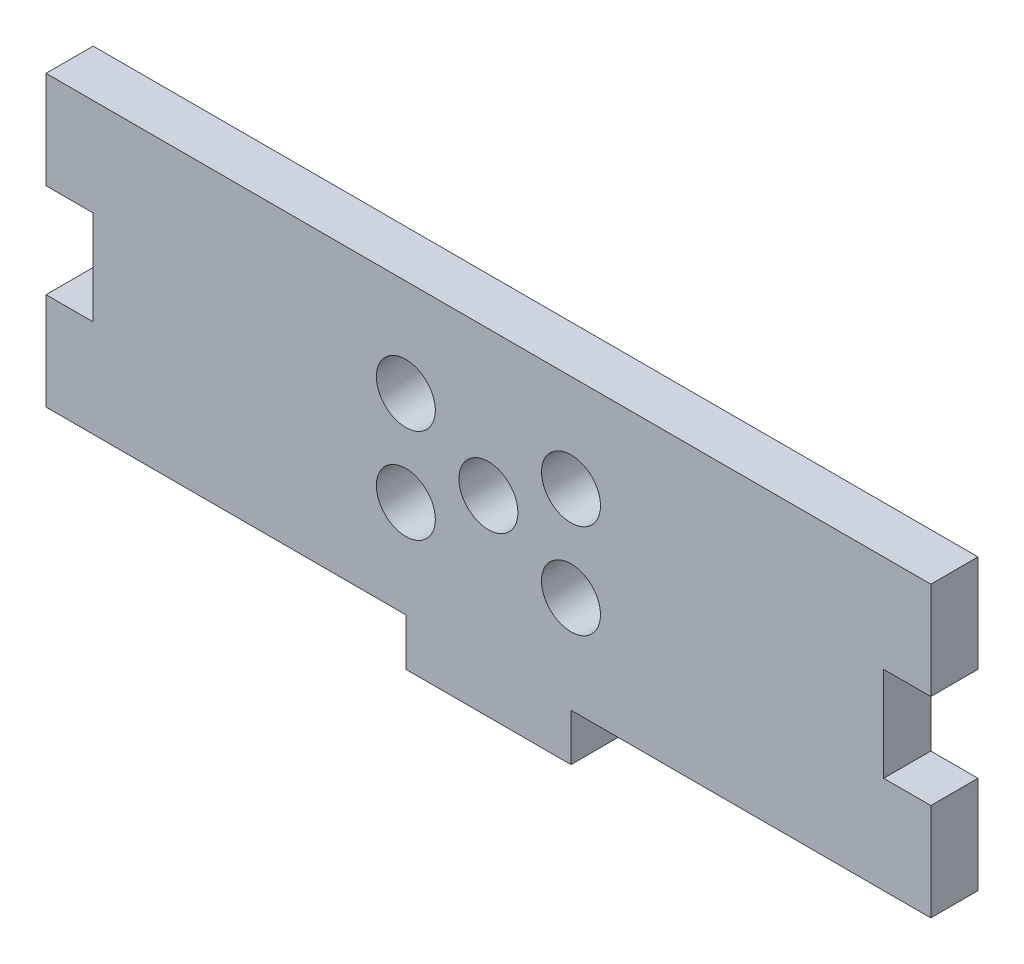
ISO-10303-21;
HEADER;
FILE_DESCRIPTION(('STEP AP214'),'2;1');
FILE_NAME('part.step','',(''),(''),'','','');
FILE_SCHEMA(('AUTOMOTIVE_DESIGN { 1 0 10303 214 1 1 1 1 }'));
ENDSEC;
DATA;
#1=APPLICATION_CONTEXT('core data for automotive mechanical design processes');
#2=APPLICATION_PROTOCOL_DEFINITION('international standard','automotive_design',2000,#1);
#3=PRODUCT_CONTEXT('',#1,'mechanical');
#4=PRODUCT('Part','Part','',(#3));
#5=PRODUCT_RELATED_PRODUCT_CATEGORY('part','',(#4));
#6=PRODUCT_DEFINITION_FORMATION('','',#4);
#7=PRODUCT_DEFINITION_CONTEXT('part definition',#1,'design');
#8=PRODUCT_DEFINITION('design','',#6,#7);
#9=PRODUCT_DEFINITION_SHAPE('','',#8);
#10=(LENGTH_UNIT() NAMED_UNIT(*) SI_UNIT(.MILLI.,.METRE.));
#11=(NAMED_UNIT(*) PLANE_ANGLE_UNIT() SI_UNIT($,.RADIAN.));
#12=(NAMED_UNIT(*) SI_UNIT($,.STERADIAN.) SOLID_ANGLE_UNIT());
#13=UNCERTAINTY_MEASURE_WITH_UNIT(LENGTH_MEASURE(1.E-05),#10,'distance_accuracy_value','');
#14=(GEOMETRIC_REPRESENTATION_CONTEXT(3) GLOBAL_UNCERTAINTY_ASSIGNED_CONTEXT((#13)) GLOBAL_UNIT_ASSIGNED_CONTEXT((#10,
#11,#12)) REPRESENTATION_CONTEXT('',''));
#15=CARTESIAN_POINT('',(0.,0.,0.));
#16=DIRECTION('',(0.,0.,1.));
#17=DIRECTION('',(1.,0.,0.));
#18=AXIS2_PLACEMENT_3D('',#15,#16,#17);
#19=CARTESIAN_POINT('',(-37.5,-12.25,4.00000000000004));
#20=DIRECTION('',(0.,0.,1.));
#21=DIRECTION('',(1.,0.,0.));
#22=AXIS2_PLACEMENT_3D('',#19,#20,#21);
#23=PLANE('',#22);
#24=CARTESIAN_POINT('',(-7.,-4.,4.));
#25=DIRECTION('',(0.,0.,1.));
#26=DIRECTION('',(1.,0.,0.));
#27=AXIS2_PLACEMENT_3D('',#24,#25,#26);
#28=CIRCLE('',#27,2.5);
#29=CARTESIAN_POINT('',(-4.49999999999999,-4.,4.));
#30=VERTEX_POINT('',#29);
#31=EDGE_CURVE('E355',#30,#30,#28,.T.);
#32=ORIENTED_EDGE('',*,*,#31,.F.);
#33=EDGE_LOOP('',(#32));
#34=FACE_BOUND('',#33,.T.);
#35=CARTESIAN_POINT('',(7.00000000000001,4.00000000000001,4.));
#36=DIRECTION('',(0.,0.,1.));
#37=DIRECTION('',(1.,0.,0.));
#38=AXIS2_PLACEMENT_3D('',#35,#36,#37);
#39=CIRCLE('',#38,2.5);
#40=CARTESIAN_POINT('',(9.50000000000001,4.00000000000001,4.));
#41=VERTEX_POINT('',#40);
#42=EDGE_CURVE('E367',#41,#41,#39,.T.);
#43=ORIENTED_EDGE('',*,*,#42,.F.);
#44=EDGE_LOOP('',(#43));
#45=FACE_BOUND('',#44,.T.);
#46=DIRECTION('',(1.,0.,0.));
#47=VECTOR('',#46,1.);
#48=CARTESIAN_POINT('',(-7.,-12.25,4.00000000000004));
#49=LINE('',#48,#47);
#50=CARTESIAN_POINT('',(-37.5,-12.25,4.00000000000004));
#51=VERTEX_POINT('',#50);
#52=CARTESIAN_POINT('',(-7.,-12.25,4.00000000000004));
#53=VERTEX_POINT('',#52);
#54=EDGE_CURVE('E216',#51,#53,#49,.T.);
#55=ORIENTED_EDGE('',*,*,#54,.T.);
#56=DIRECTION('',(0.,-1.,0.));
#57=VECTOR('',#56,1.);
#58=CARTESIAN_POINT('',(-7.,-12.25,4.00000000000004));
#59=LINE('',#58,#57);
#60=CARTESIAN_POINT('',(-7.00000000000001,-16.25,4.00000000000004));
#61=VERTEX_POINT('',#60);
#62=EDGE_CURVE('E124',#53,#61,#59,.T.);
#63=ORIENTED_EDGE('',*,*,#62,.T.);
#64=DIRECTION('',(1.,0.,0.));
#65=VECTOR('',#64,1.);
#66=CARTESIAN_POINT('',(-7.00000000000001,-16.25,4.00000000000004));
#67=LINE('',#66,#65);
#68=CARTESIAN_POINT('',(7.00000000000001,-16.25,4.));
#69=VERTEX_POINT('',#68);
#70=EDGE_CURVE('E255',#61,#69,#67,.T.);
#71=ORIENTED_EDGE('',*,*,#70,.T.);
#72=DIRECTION('',(0.,1.,0.));
#73=VECTOR('',#72,1.);
#74=CARTESIAN_POINT('',(7.00000000000001,-16.25,4.));
#75=LINE('',#74,#73);
#76=CARTESIAN_POINT('',(7.00000000000001,-12.25,4.));
#77=VERTEX_POINT('',#76);
#78=EDGE_CURVE('E274',#69,#77,#75,.T.);
#79=ORIENTED_EDGE('',*,*,#78,.T.);
#80=DIRECTION('',(1.,0.,0.));
#81=VECTOR('',#80,1.);
#82=CARTESIAN_POINT('',(37.5,-12.25,4.));
#83=LINE('',#82,#81);
#84=CARTESIAN_POINT('',(37.5,-12.25,4.));
#85=VERTEX_POINT('',#84);
#86=EDGE_CURVE('E271',#77,#85,#83,.T.);
#87=ORIENTED_EDGE('',*,*,#86,.T.);
#88=DIRECTION('',(0.,1.,0.));
#89=VECTOR('',#88,1.);
#90=CARTESIAN_POINT('',(37.5000000000001,-4.00000000000002,4.));
#91=LINE('',#90,#89);
#92=CARTESIAN_POINT('',(37.5000000000001,-4.00000000000002,4.));
#93=VERTEX_POINT('',#92);
#94=EDGE_CURVE('E273',#85,#93,#91,.T.);
#95=ORIENTED_EDGE('',*,*,#94,.T.);
#96=DIRECTION('',(-1.,0.,0.));
#97=VECTOR('',#96,1.);
#98=CARTESIAN_POINT('',(33.5,-4.00000000000001,4.));
#99=LINE('',#98,#97);
#100=CARTESIAN_POINT('',(33.5,-4.00000000000001,4.));
#101=VERTEX_POINT('',#100);
#102=EDGE_CURVE('E276',#93,#101,#99,.T.);
#103=ORIENTED_EDGE('',*,*,#102,.T.);
#104=DIRECTION('',(0.,1.,0.));
#105=VECTOR('',#104,1.);
#106=CARTESIAN_POINT('',(33.5,4.,4.00000000000004));
#107=LINE('',#106,#105);
#108=CARTESIAN_POINT('',(33.5,4.,4.00000000000004));
#109=VERTEX_POINT('',#108);
#110=EDGE_CURVE('E282',#101,#109,#107,.T.);
#111=ORIENTED_EDGE('',*,*,#110,.T.);
#112=DIRECTION('',(1.,0.,0.));
#113=VECTOR('',#112,1.);
#114=CARTESIAN_POINT('',(37.5,4.00000000000001,4.));
#115=LINE('',#114,#113);
#116=CARTESIAN_POINT('',(37.5,4.00000000000001,4.));
#117=VERTEX_POINT('',#116);
#118=EDGE_CURVE('E284',#109,#117,#115,.T.);
#119=ORIENTED_EDGE('',*,*,#118,.T.);
#120=DIRECTION('',(0.,1.,0.));
#121=VECTOR('',#120,1.);
#122=CARTESIAN_POINT('',(37.5,12.25,4.00000000000008));
#123=LINE('',#122,#121);
#124=CARTESIAN_POINT('',(37.5,12.25,4.00000000000008));
#125=VERTEX_POINT('',#124);
#126=EDGE_CURVE('E286',#117,#125,#123,.T.);
#127=ORIENTED_EDGE('',*,*,#126,.T.);
#128=DIRECTION('',(-1.,0.,0.));
#129=VECTOR('',#128,1.);
#130=CARTESIAN_POINT('',(37.5,12.25,4.00000000000008));
#131=LINE('',#130,#129);
#132=CARTESIAN_POINT('',(-37.5,12.25,4.));
#133=VERTEX_POINT('',#132);
#134=EDGE_CURVE('E288',#125,#133,#131,.T.);
#135=ORIENTED_EDGE('',*,*,#134,.T.);
#136=DIRECTION('',(0.,-1.,0.));
#137=VECTOR('',#136,1.);
#138=CARTESIAN_POINT('',(-37.5,12.25,4.));
#139=LINE('',#138,#137);
#140=CARTESIAN_POINT('',(-37.5,4.,4.));
#141=VERTEX_POINT('',#140);
#142=EDGE_CURVE('E290',#133,#141,#139,.T.);
#143=ORIENTED_EDGE('',*,*,#142,.T.);
#144=DIRECTION('',(1.,0.,0.));
#145=VECTOR('',#144,1.);
#146=CARTESIAN_POINT('',(-37.5,4.,4.));
#147=LINE('',#146,#145);
#148=CARTESIAN_POINT('',(-33.5,4.00000000000002,3.99999999999999));
#149=VERTEX_POINT('',#148);
#150=EDGE_CURVE('E167',#141,#149,#147,.T.);
#151=ORIENTED_EDGE('',*,*,#150,.T.);
#152=DIRECTION('',(0.,-1.,0.));
#153=VECTOR('',#152,1.);
#154=CARTESIAN_POINT('',(-33.5,4.00000000000002,3.99999999999999));
#155=LINE('',#154,#153);
#156=CARTESIAN_POINT('',(-33.5,-4.00000000000001,4.00000000000004));
#157=VERTEX_POINT('',#156);
#158=EDGE_CURVE('E161',#149,#157,#155,.T.);
#159=ORIENTED_EDGE('',*,*,#158,.T.);
#160=DIRECTION('',(-1.,0.,0.));
#161=VECTOR('',#160,1.);
#162=CARTESIAN_POINT('',(-33.5,-4.00000000000001,4.00000000000004));
#163=LINE('',#162,#161);
#164=CARTESIAN_POINT('',(-37.5,-4.00000000000002,4.));
#165=VERTEX_POINT('',#164);
#166=EDGE_CURVE('E165',#157,#165,#163,.T.);
#167=ORIENTED_EDGE('',*,*,#166,.T.);
#168=DIRECTION('',(0.,-1.,0.));
#169=VECTOR('',#168,1.);
#170=CARTESIAN_POINT('',(-37.5,-4.00000000000002,4.));
#171=LINE('',#170,#169);
#172=EDGE_CURVE('E57',#165,#51,#171,.T.);
#173=ORIENTED_EDGE('',*,*,#172,.T.);
#174=EDGE_LOOP('',(#55,#63,#71,#79,#87,#95,#103,#111,#119,#127,#135,#143,#151,#159,#167,#173));
#175=FACE_BOUND('',#174,.T.);
#176=CARTESIAN_POINT('',(0.,0.,4.));
#177=DIRECTION('',(0.,0.,1.));
#178=DIRECTION('',(1.,0.,0.));
#179=AXIS2_PLACEMENT_3D('',#176,#177,#178);
#180=CIRCLE('',#179,2.5);
#181=CARTESIAN_POINT('',(2.5,0.,4.));
#182=VERTEX_POINT('',#181);
#183=EDGE_CURVE('E189',#182,#182,#180,.T.);
#184=ORIENTED_EDGE('',*,*,#183,.F.);
#185=EDGE_LOOP('',(#184));
#186=FACE_BOUND('',#185,.T.);
#187=CARTESIAN_POINT('',(7.00000000000001,-4.00000000000001,4.00000000000005));
#188=DIRECTION('',(0.,0.,1.));
#189=DIRECTION('',(-1.,0.,0.));
#190=AXIS2_PLACEMENT_3D('',#187,#188,#189);
#191=CIRCLE('',#190,2.5);
#192=CARTESIAN_POINT('',(4.50000000000001,-4.00000000000001,4.00000000000005));
#193=VERTEX_POINT('',#192);
#194=EDGE_CURVE('E361',#193,#193,#191,.T.);
#195=ORIENTED_EDGE('',*,*,#194,.F.);
#196=EDGE_LOOP('',(#195));
#197=FACE_BOUND('',#196,.T.);
#198=CARTESIAN_POINT('',(-7.,4.00000000000002,4.));
#199=DIRECTION('',(0.,0.,1.));
#200=DIRECTION('',(-1.,0.,0.));
#201=AXIS2_PLACEMENT_3D('',#198,#199,#200);
#202=CIRCLE('',#201,2.5);
#203=CARTESIAN_POINT('',(-9.5,4.00000000000002,4.));
#204=VERTEX_POINT('',#203);
#205=EDGE_CURVE('E346',#204,#204,#202,.T.);
#206=ORIENTED_EDGE('',*,*,#205,.F.);
#207=EDGE_LOOP('',(#206));
#208=FACE_BOUND('',#207,.T.);
#209=ADVANCED_FACE('F40',(#34,#45,#175,#186,#197,#208),#23,.T.);
#210=CARTESIAN_POINT('',(-37.5,-12.25,0.));
#211=DIRECTION('',(0.,0.,1.));
#212=DIRECTION('',(1.,0.,0.));
#213=AXIS2_PLACEMENT_3D('',#210,#211,#212);
#214=PLANE('',#213);
#215=CARTESIAN_POINT('',(-7.00000000000002,-4.00000000000001,0.));
#216=DIRECTION('',(0.,0.,1.));
#217=DIRECTION('',(1.,0.,0.));
#218=AXIS2_PLACEMENT_3D('',#215,#216,#217);
#219=CIRCLE('',#218,2.5);
#220=CARTESIAN_POINT('',(-4.50000000000001,-4.00000000000001,0.));
#221=VERTEX_POINT('',#220);
#222=EDGE_CURVE('E352',#221,#221,#219,.T.);
#223=ORIENTED_EDGE('',*,*,#222,.T.);
#224=EDGE_LOOP('',(#223));
#225=FACE_BOUND('',#224,.T.);
#226=CARTESIAN_POINT('',(7.00000000000001,4.00000000000001,0.));
#227=DIRECTION('',(0.,0.,1.));
#228=DIRECTION('',(1.,0.,0.));
#229=AXIS2_PLACEMENT_3D('',#226,#227,#228);
#230=CIRCLE('',#229,2.5);
#231=CARTESIAN_POINT('',(9.50000000000002,4.00000000000001,0.));
#232=VERTEX_POINT('',#231);
#233=EDGE_CURVE('E364',#232,#232,#230,.T.);
#234=ORIENTED_EDGE('',*,*,#233,.T.);
#235=EDGE_LOOP('',(#234));
#236=FACE_BOUND('',#235,.T.);
#237=DIRECTION('',(1.,0.,0.));
#238=VECTOR('',#237,1.);
#239=CARTESIAN_POINT('',(-7.00000000000001,-12.25,0.));
#240=LINE('',#239,#238);
#241=CARTESIAN_POINT('',(-37.5,-12.25,0.));
#242=VERTEX_POINT('',#241);
#243=CARTESIAN_POINT('',(-7.00000000000001,-12.25,0.));
#244=VERTEX_POINT('',#243);
#245=EDGE_CURVE('E185',#242,#244,#240,.T.);
#246=ORIENTED_EDGE('',*,*,#245,.F.);
#247=DIRECTION('',(0.,-1.,0.));
#248=VECTOR('',#247,1.);
#249=CARTESIAN_POINT('',(-37.5,-4.,0.));
#250=LINE('',#249,#248);
#251=CARTESIAN_POINT('',(-37.5,-4.,0.));
#252=VERTEX_POINT('',#251);
#253=EDGE_CURVE('E116',#252,#242,#250,.T.);
#254=ORIENTED_EDGE('',*,*,#253,.F.);
#255=DIRECTION('',(-1.,0.,0.));
#256=VECTOR('',#255,1.);
#257=CARTESIAN_POINT('',(-33.5,-4.,0.));
#258=LINE('',#257,#256);
#259=CARTESIAN_POINT('',(-33.5,-4.,0.));
#260=VERTEX_POINT('',#259);
#261=EDGE_CURVE('E110',#260,#252,#258,.T.);
#262=ORIENTED_EDGE('',*,*,#261,.F.);
#263=DIRECTION('',(0.,-1.,0.));
#264=VECTOR('',#263,1.);
#265=CARTESIAN_POINT('',(-33.5,4.00000000000001,0.));
#266=LINE('',#265,#264);
#267=CARTESIAN_POINT('',(-33.5,4.00000000000001,0.));
#268=VERTEX_POINT('',#267);
#269=EDGE_CURVE('E175',#268,#260,#266,.T.);
#270=ORIENTED_EDGE('',*,*,#269,.F.);
#271=DIRECTION('',(1.,0.,0.));
#272=VECTOR('',#271,1.);
#273=CARTESIAN_POINT('',(-37.5000000000001,4.00000000000002,0.));
#274=LINE('',#273,#272);
#275=CARTESIAN_POINT('',(-37.5000000000001,4.00000000000002,0.));
#276=VERTEX_POINT('',#275);
#277=EDGE_CURVE('E211',#276,#268,#274,.T.);
#278=ORIENTED_EDGE('',*,*,#277,.F.);
#279=DIRECTION('',(0.,-1.,0.));
#280=VECTOR('',#279,1.);
#281=CARTESIAN_POINT('',(-37.5,12.25,0.));
#282=LINE('',#281,#280);
#283=CARTESIAN_POINT('',(-37.5,12.25,0.));
#284=VERTEX_POINT('',#283);
#285=EDGE_CURVE('E209',#284,#276,#282,.T.);
#286=ORIENTED_EDGE('',*,*,#285,.F.);
#287=DIRECTION('',(-1.,0.,0.));
#288=VECTOR('',#287,1.);
#289=CARTESIAN_POINT('',(37.5,12.25,0.));
#290=LINE('',#289,#288);
#291=CARTESIAN_POINT('',(37.5,12.25,0.));
#292=VERTEX_POINT('',#291);
#293=EDGE_CURVE('E207',#292,#284,#290,.T.);
#294=ORIENTED_EDGE('',*,*,#293,.F.);
#295=DIRECTION('',(0.,1.,0.));
#296=VECTOR('',#295,1.);
#297=CARTESIAN_POINT('',(37.5,12.25,0.));
#298=LINE('',#297,#296);
#299=CARTESIAN_POINT('',(37.5,4.00000000000001,0.));
#300=VERTEX_POINT('',#299);
#301=EDGE_CURVE('E205',#300,#292,#298,.T.);
#302=ORIENTED_EDGE('',*,*,#301,.F.);
#303=DIRECTION('',(1.,0.,0.));
#304=VECTOR('',#303,1.);
#305=CARTESIAN_POINT('',(37.5,4.00000000000001,0.));
#306=LINE('',#305,#304);
#307=CARTESIAN_POINT('',(33.5,4.,0.));
#308=VERTEX_POINT('',#307);
#309=EDGE_CURVE('E203',#308,#300,#306,.T.);
#310=ORIENTED_EDGE('',*,*,#309,.F.);
#311=DIRECTION('',(0.,1.,0.));
#312=VECTOR('',#311,1.);
#313=CARTESIAN_POINT('',(33.5,4.,0.));
#314=LINE('',#313,#312);
#315=CARTESIAN_POINT('',(33.5,-4.00000000000002,0.));
#316=VERTEX_POINT('',#315);
#317=EDGE_CURVE('E201',#316,#308,#314,.T.);
#318=ORIENTED_EDGE('',*,*,#317,.F.);
#319=DIRECTION('',(-1.,0.,0.));
#320=VECTOR('',#319,1.);
#321=CARTESIAN_POINT('',(33.5,-4.00000000000002,0.));
#322=LINE('',#321,#320);
#323=CARTESIAN_POINT('',(37.5,-4.,0.));
#324=VERTEX_POINT('',#323);
#325=EDGE_CURVE('E199',#324,#316,#322,.T.);
#326=ORIENTED_EDGE('',*,*,#325,.F.);
#327=DIRECTION('',(0.,1.,0.));
#328=VECTOR('',#327,1.);
#329=CARTESIAN_POINT('',(37.5,-4.,0.));
#330=LINE('',#329,#328);
#331=CARTESIAN_POINT('',(37.5,-12.25,0.));
#332=VERTEX_POINT('',#331);
#333=EDGE_CURVE('E197',#332,#324,#330,.T.);
#334=ORIENTED_EDGE('',*,*,#333,.F.);
#335=DIRECTION('',(1.,0.,0.));
#336=VECTOR('',#335,1.);
#337=CARTESIAN_POINT('',(37.5,-12.25,0.));
#338=LINE('',#337,#336);
#339=CARTESIAN_POINT('',(7.00000000000002,-12.25,0.));
#340=VERTEX_POINT('',#339);
#341=EDGE_CURVE('E195',#340,#332,#338,.T.);
#342=ORIENTED_EDGE('',*,*,#341,.F.);
#343=DIRECTION('',(0.,1.,0.));
#344=VECTOR('',#343,1.);
#345=CARTESIAN_POINT('',(7.00000000000001,-16.25,0.));
#346=LINE('',#345,#344);
#347=CARTESIAN_POINT('',(7.00000000000001,-16.25,0.));
#348=VERTEX_POINT('',#347);
#349=EDGE_CURVE('E193',#348,#340,#346,.T.);
#350=ORIENTED_EDGE('',*,*,#349,.F.);
#351=DIRECTION('',(1.,0.,0.));
#352=VECTOR('',#351,1.);
#353=CARTESIAN_POINT('',(-6.99999999999998,-16.25,0.));
#354=LINE('',#353,#352);
#355=CARTESIAN_POINT('',(-6.99999999999998,-16.25,0.));
#356=VERTEX_POINT('',#355);
#357=EDGE_CURVE('E191',#356,#348,#354,.T.);
#358=ORIENTED_EDGE('',*,*,#357,.F.);
#359=DIRECTION('',(0.,-1.,0.));
#360=VECTOR('',#359,1.);
#361=CARTESIAN_POINT('',(-7.00000000000001,-12.25,0.));
#362=LINE('',#361,#360);
#363=EDGE_CURVE('E188',#244,#356,#362,.T.);
#364=ORIENTED_EDGE('',*,*,#363,.F.);
#365=EDGE_LOOP('',(#246,#254,#262,#270,#278,#286,#294,#302,#310,#318,#326,#334,#342,#350,#358,#364));
#366=FACE_BOUND('',#365,.T.);
#367=CARTESIAN_POINT('',(0.,0.,0.));
#368=DIRECTION('',(0.,0.,1.));
#369=DIRECTION('',(1.,0.,0.));
#370=AXIS2_PLACEMENT_3D('',#367,#368,#369);
#371=CIRCLE('',#370,2.5);
#372=CARTESIAN_POINT('',(2.50000000000001,0.,0.));
#373=VERTEX_POINT('',#372);
#374=EDGE_CURVE('E370',#373,#373,#371,.T.);
#375=ORIENTED_EDGE('',*,*,#374,.T.);
#376=EDGE_LOOP('',(#375));
#377=FACE_BOUND('',#376,.T.);
#378=CARTESIAN_POINT('',(7.00000000000001,-4.00000000000001,0.));
#379=DIRECTION('',(0.,0.,1.));
#380=DIRECTION('',(-1.,0.,0.));
#381=AXIS2_PLACEMENT_3D('',#378,#379,#380);
#382=CIRCLE('',#381,2.5);
#383=CARTESIAN_POINT('',(4.50000000000001,-4.00000000000001,0.));
#384=VERTEX_POINT('',#383);
#385=EDGE_CURVE('E358',#384,#384,#382,.T.);
#386=ORIENTED_EDGE('',*,*,#385,.T.);
#387=EDGE_LOOP('',(#386));
#388=FACE_BOUND('',#387,.T.);
#389=CARTESIAN_POINT('',(-7.00000000000002,4.00000000000001,0.));
#390=DIRECTION('',(0.,0.,1.));
#391=DIRECTION('',(-1.,0.,0.));
#392=AXIS2_PLACEMENT_3D('',#389,#390,#391);
#393=CIRCLE('',#392,2.5);
#394=CARTESIAN_POINT('',(-9.50000000000002,4.00000000000001,0.));
#395=VERTEX_POINT('',#394);
#396=EDGE_CURVE('E349',#395,#395,#393,.T.);
#397=ORIENTED_EDGE('',*,*,#396,.T.);
#398=EDGE_LOOP('',(#397));
#399=FACE_BOUND('',#398,.T.);
#400=ADVANCED_FACE('F259',(#225,#236,#366,#377,#388,#399),#214,.F.);
#401=CARTESIAN_POINT('',(-7.,-12.25,4.00000000000004));
#402=DIRECTION('',(0.,1.,0.));
#403=DIRECTION('',(-1.,0.,0.));
#404=AXIS2_PLACEMENT_3D('',#401,#402,#403);
#405=PLANE('',#404);
#406=ORIENTED_EDGE('',*,*,#245,.T.);
#407=DIRECTION('',(0.,0.,-1.));
#408=VECTOR('',#407,1.);
#409=CARTESIAN_POINT('',(-7.,-12.25,4.00000000000004));
#410=LINE('',#409,#408);
#411=EDGE_CURVE('E13',#53,#244,#410,.T.);
#412=ORIENTED_EDGE('',*,*,#411,.F.);
#413=ORIENTED_EDGE('',*,*,#54,.F.);
#414=DIRECTION('',(0.,0.,-1.));
#415=VECTOR('',#414,1.);
#416=CARTESIAN_POINT('',(-37.5,-12.25,4.00000000000004));
#417=LINE('',#416,#415);
#418=EDGE_CURVE('E181',#51,#242,#417,.T.);
#419=ORIENTED_EDGE('',*,*,#418,.T.);
#420=EDGE_LOOP('',(#406,#412,#413,#419));
#421=FACE_BOUND('',#420,.T.);
#422=ADVANCED_FACE('F42',(#421),#405,.F.);
#423=CARTESIAN_POINT('',(-7.,-12.25,4.00000000000004));
#424=DIRECTION('',(1.,0.,0.));
#425=DIRECTION('',(0.,1.,0.));
#426=AXIS2_PLACEMENT_3D('',#423,#424,#425);
#427=PLANE('',#426);
#428=ORIENTED_EDGE('',*,*,#363,.T.);
#429=DIRECTION('',(0.,0.,-1.));
#430=VECTOR('',#429,1.);
#431=CARTESIAN_POINT('',(-7.00000000000001,-16.25,4.00000000000004));
#432=LINE('',#431,#430);
#433=EDGE_CURVE('E49',#61,#356,#432,.T.);
#434=ORIENTED_EDGE('',*,*,#433,.F.);
#435=ORIENTED_EDGE('',*,*,#62,.F.);
#436=ORIENTED_EDGE('',*,*,#411,.T.);
#437=EDGE_LOOP('',(#428,#434,#435,#436));
#438=FACE_BOUND('',#437,.T.);
#439=ADVANCED_FACE('F500',(#438),#427,.F.);
#440=CARTESIAN_POINT('',(-7.00000000000001,-16.25,4.00000000000004));
#441=DIRECTION('',(0.,1.,0.));
#442=DIRECTION('',(0.,0.,1.));
#443=AXIS2_PLACEMENT_3D('',#440,#441,#442);
#444=PLANE('',#443);
#445=ORIENTED_EDGE('',*,*,#357,.T.);
#446=DIRECTION('',(0.,0.,-1.));
#447=VECTOR('',#446,1.);
#448=CARTESIAN_POINT('',(7.00000000000001,-16.25,4.));
#449=LINE('',#448,#447);
#450=EDGE_CURVE('E247',#69,#348,#449,.T.);
#451=ORIENTED_EDGE('',*,*,#450,.F.);
#452=ORIENTED_EDGE('',*,*,#70,.F.);
#453=ORIENTED_EDGE('',*,*,#433,.T.);
#454=EDGE_LOOP('',(#445,#451,#452,#453));
#455=FACE_BOUND('',#454,.T.);
#456=ADVANCED_FACE('F253',(#455),#444,.F.);
#457=CARTESIAN_POINT('',(7.00000000000001,-16.25,4.));
#458=DIRECTION('',(-1.,0.,0.));
#459=DIRECTION('',(0.,-1.,0.));
#460=AXIS2_PLACEMENT_3D('',#457,#458,#459);
#461=PLANE('',#460);
#462=ORIENTED_EDGE('',*,*,#349,.T.);
#463=DIRECTION('',(0.,0.,-1.));
#464=VECTOR('',#463,1.);
#465=CARTESIAN_POINT('',(7.00000000000001,-12.25,4.));
#466=LINE('',#465,#464);
#467=EDGE_CURVE('E244',#77,#340,#466,.T.);
#468=ORIENTED_EDGE('',*,*,#467,.F.);
#469=ORIENTED_EDGE('',*,*,#78,.F.);
#470=ORIENTED_EDGE('',*,*,#450,.T.);
#471=EDGE_LOOP('',(#462,#468,#469,#470));
#472=FACE_BOUND('',#471,.T.);
#473=ADVANCED_FACE('F265',(#472),#461,.F.);
#474=CARTESIAN_POINT('',(37.5,-12.25,4.));
#475=DIRECTION('',(0.,1.,0.));
#476=DIRECTION('',(-1.,0.,0.));
#477=AXIS2_PLACEMENT_3D('',#474,#475,#476);
#478=PLANE('',#477);
#479=ORIENTED_EDGE('',*,*,#341,.T.);
#480=DIRECTION('',(0.,0.,-1.));
#481=VECTOR('',#480,1.);
#482=CARTESIAN_POINT('',(37.5,-12.25,4.));
#483=LINE('',#482,#481);
#484=EDGE_CURVE('E241',#85,#332,#483,.T.);
#485=ORIENTED_EDGE('',*,*,#484,.F.);
#486=ORIENTED_EDGE('',*,*,#86,.F.);
#487=ORIENTED_EDGE('',*,*,#467,.T.);
#488=EDGE_LOOP('',(#479,#485,#486,#487));
#489=FACE_BOUND('',#488,.T.);
#490=ADVANCED_FACE('F269',(#489),#478,.F.);
#491=CARTESIAN_POINT('',(37.5000000000001,-4.00000000000002,4.));
#492=DIRECTION('',(-1.,0.,0.));
#493=DIRECTION('',(0.,0.,1.));
#494=AXIS2_PLACEMENT_3D('',#491,#492,#493);
#495=PLANE('',#494);
#496=ORIENTED_EDGE('',*,*,#333,.T.);
#497=DIRECTION('',(0.,0.,-1.));
#498=VECTOR('',#497,1.);
#499=CARTESIAN_POINT('',(37.5000000000001,-4.00000000000002,4.));
#500=LINE('',#499,#498);
#501=EDGE_CURVE('E238',#93,#324,#500,.T.);
#502=ORIENTED_EDGE('',*,*,#501,.F.);
#503=ORIENTED_EDGE('',*,*,#94,.F.);
#504=ORIENTED_EDGE('',*,*,#484,.T.);
#505=EDGE_LOOP('',(#496,#502,#503,#504));
#506=FACE_BOUND('',#505,.T.);
#507=ADVANCED_FACE('F473',(#506),#495,.F.);
#508=CARTESIAN_POINT('',(33.5,-4.00000000000001,4.));
#509=DIRECTION('',(0.,-1.,0.));
#510=DIRECTION('',(1.,0.,0.));
#511=AXIS2_PLACEMENT_3D('',#508,#509,#510);
#512=PLANE('',#511);
#513=ORIENTED_EDGE('',*,*,#325,.T.);
#514=DIRECTION('',(0.,0.,-1.));
#515=VECTOR('',#514,1.);
#516=CARTESIAN_POINT('',(33.5,-4.00000000000001,4.));
#517=LINE('',#516,#515);
#518=EDGE_CURVE('E235',#101,#316,#517,.T.);
#519=ORIENTED_EDGE('',*,*,#518,.F.);
#520=ORIENTED_EDGE('',*,*,#102,.F.);
#521=ORIENTED_EDGE('',*,*,#501,.T.);
#522=EDGE_LOOP('',(#513,#519,#520,#521));
#523=FACE_BOUND('',#522,.T.);
#524=ADVANCED_FACE('F465',(#523),#512,.F.);
#525=CARTESIAN_POINT('',(33.5,4.,4.00000000000004));
#526=DIRECTION('',(-1.,0.,0.));
#527=DIRECTION('',(0.,0.,1.));
#528=AXIS2_PLACEMENT_3D('',#525,#526,#527);
#529=PLANE('',#528);
#530=ORIENTED_EDGE('',*,*,#317,.T.);
#531=DIRECTION('',(0.,0.,-1.));
#532=VECTOR('',#531,1.);
#533=CARTESIAN_POINT('',(33.5,4.,4.00000000000004));
#534=LINE('',#533,#532);
#535=EDGE_CURVE('E232',#109,#308,#534,.T.);
#536=ORIENTED_EDGE('',*,*,#535,.F.);
#537=ORIENTED_EDGE('',*,*,#110,.F.);
#538=ORIENTED_EDGE('',*,*,#518,.T.);
#539=EDGE_LOOP('',(#530,#536,#537,#538));
#540=FACE_BOUND('',#539,.T.);
#541=ADVANCED_FACE('F457',(#540),#529,.F.);
#542=CARTESIAN_POINT('',(37.5,4.00000000000001,4.));
#543=DIRECTION('',(0.,1.,0.));
#544=DIRECTION('',(-1.,0.,0.));
#545=AXIS2_PLACEMENT_3D('',#542,#543,#544);
#546=PLANE('',#545);
#547=ORIENTED_EDGE('',*,*,#309,.T.);
#548=DIRECTION('',(0.,0.,-1.));
#549=VECTOR('',#548,1.);
#550=CARTESIAN_POINT('',(37.5,4.00000000000001,4.));
#551=LINE('',#550,#549);
#552=EDGE_CURVE('E229',#117,#300,#551,.T.);
#553=ORIENTED_EDGE('',*,*,#552,.F.);
#554=ORIENTED_EDGE('',*,*,#118,.F.);
#555=ORIENTED_EDGE('',*,*,#535,.T.);
#556=EDGE_LOOP('',(#547,#553,#554,#555));
#557=FACE_BOUND('',#556,.T.);
#558=ADVANCED_FACE('F449',(#557),#546,.F.);
#559=CARTESIAN_POINT('',(37.5,12.25,4.00000000000008));
#560=DIRECTION('',(-1.,0.,0.));
#561=DIRECTION('',(0.,0.,1.));
#562=AXIS2_PLACEMENT_3D('',#559,#560,#561);
#563=PLANE('',#562);
#564=ORIENTED_EDGE('',*,*,#301,.T.);
#565=DIRECTION('',(0.,0.,-1.));
#566=VECTOR('',#565,1.);
#567=CARTESIAN_POINT('',(37.5,12.25,4.00000000000008));
#568=LINE('',#567,#566);
#569=EDGE_CURVE('E226',#125,#292,#568,.T.);
#570=ORIENTED_EDGE('',*,*,#569,.F.);
#571=ORIENTED_EDGE('',*,*,#126,.F.);
#572=ORIENTED_EDGE('',*,*,#552,.T.);
#573=EDGE_LOOP('',(#564,#570,#571,#572));
#574=FACE_BOUND('',#573,.T.);
#575=ADVANCED_FACE('F441',(#574),#563,.F.);
#576=CARTESIAN_POINT('',(37.5,12.25,4.00000000000008));
#577=DIRECTION('',(0.,-1.,0.));
#578=DIRECTION('',(1.,0.,0.));
#579=AXIS2_PLACEMENT_3D('',#576,#577,#578);
#580=PLANE('',#579);
#581=ORIENTED_EDGE('',*,*,#293,.T.);
#582=DIRECTION('',(0.,0.,-1.));
#583=VECTOR('',#582,1.);
#584=CARTESIAN_POINT('',(-37.5,12.25,4.));
#585=LINE('',#584,#583);
#586=EDGE_CURVE('E223',#133,#284,#585,.T.);
#587=ORIENTED_EDGE('',*,*,#586,.F.);
#588=ORIENTED_EDGE('',*,*,#134,.F.);
#589=ORIENTED_EDGE('',*,*,#569,.T.);
#590=EDGE_LOOP('',(#581,#587,#588,#589));
#591=FACE_BOUND('',#590,.T.);
#592=ADVANCED_FACE('F434',(#591),#580,.F.);
#593=CARTESIAN_POINT('',(-37.5,12.25,4.));
#594=DIRECTION('',(1.,0.,0.));
#595=DIRECTION('',(0.,0.,-1.));
#596=AXIS2_PLACEMENT_3D('',#593,#594,#595);
#597=PLANE('',#596);
#598=ORIENTED_EDGE('',*,*,#285,.T.);
#599=DIRECTION('',(0.,0.,-1.));
#600=VECTOR('',#599,1.);
#601=CARTESIAN_POINT('',(-37.5,4.,4.));
#602=LINE('',#601,#600);
#603=EDGE_CURVE('E220',#141,#276,#602,.T.);
#604=ORIENTED_EDGE('',*,*,#603,.F.);
#605=ORIENTED_EDGE('',*,*,#142,.F.);
#606=ORIENTED_EDGE('',*,*,#586,.T.);
#607=EDGE_LOOP('',(#598,#604,#605,#606));
#608=FACE_BOUND('',#607,.T.);
#609=ADVANCED_FACE('F296',(#608),#597,.F.);
#610=CARTESIAN_POINT('',(-37.5,4.,4.));
#611=DIRECTION('',(0.,1.,0.));
#612=DIRECTION('',(-1.,0.,0.));
#613=AXIS2_PLACEMENT_3D('',#610,#611,#612);
#614=PLANE('',#613);
#615=ORIENTED_EDGE('',*,*,#277,.T.);
#616=DIRECTION('',(0.,0.,-1.));
#617=VECTOR('',#616,1.);
#618=CARTESIAN_POINT('',(-33.5,4.00000000000002,3.99999999999999));
#619=LINE('',#618,#617);
#620=EDGE_CURVE('E176',#149,#268,#619,.T.);
#621=ORIENTED_EDGE('',*,*,#620,.F.);
#622=ORIENTED_EDGE('',*,*,#150,.F.);
#623=ORIENTED_EDGE('',*,*,#603,.T.);
#624=EDGE_LOOP('',(#615,#621,#622,#623));
#625=FACE_BOUND('',#624,.T.);
#626=ADVANCED_FACE('F300',(#625),#614,.F.);
#627=CARTESIAN_POINT('',(-33.5,4.00000000000002,3.99999999999999));
#628=DIRECTION('',(1.,0.,0.));
#629=DIRECTION('',(0.,0.,-1.));
#630=AXIS2_PLACEMENT_3D('',#627,#628,#629);
#631=PLANE('',#630);
#632=ORIENTED_EDGE('',*,*,#269,.T.);
#633=DIRECTION('',(0.,0.,-1.));
#634=VECTOR('',#633,1.);
#635=CARTESIAN_POINT('',(-33.5,-4.00000000000001,4.00000000000004));
#636=LINE('',#635,#634);
#637=EDGE_CURVE('E172',#157,#260,#636,.T.);
#638=ORIENTED_EDGE('',*,*,#637,.F.);
#639=ORIENTED_EDGE('',*,*,#158,.F.);
#640=ORIENTED_EDGE('',*,*,#620,.T.);
#641=EDGE_LOOP('',(#632,#638,#639,#640));
#642=FACE_BOUND('',#641,.T.);
#643=ADVANCED_FACE('F173',(#642),#631,.F.);
#644=CARTESIAN_POINT('',(-33.5,-4.00000000000001,4.00000000000004));
#645=DIRECTION('',(0.,-1.,0.));
#646=DIRECTION('',(0.,0.,-1.));
#647=AXIS2_PLACEMENT_3D('',#644,#645,#646);
#648=PLANE('',#647);
#649=ORIENTED_EDGE('',*,*,#261,.T.);
#650=DIRECTION('',(0.,0.,-1.));
#651=VECTOR('',#650,1.);
#652=CARTESIAN_POINT('',(-37.5,-4.00000000000002,4.));
#653=LINE('',#652,#651);
#654=EDGE_CURVE('E177',#165,#252,#653,.T.);
#655=ORIENTED_EDGE('',*,*,#654,.F.);
#656=ORIENTED_EDGE('',*,*,#166,.F.);
#657=ORIENTED_EDGE('',*,*,#637,.T.);
#658=EDGE_LOOP('',(#649,#655,#656,#657));
#659=FACE_BOUND('',#658,.T.);
#660=ADVANCED_FACE('F179',(#659),#648,.F.);
#661=CARTESIAN_POINT('',(-37.5,-4.00000000000002,4.));
#662=DIRECTION('',(1.,0.,0.));
#663=DIRECTION('',(0.,0.,-1.));
#664=AXIS2_PLACEMENT_3D('',#661,#662,#663);
#665=PLANE('',#664);
#666=ORIENTED_EDGE('',*,*,#253,.T.);
#667=ORIENTED_EDGE('',*,*,#418,.F.);
#668=ORIENTED_EDGE('',*,*,#172,.F.);
#669=ORIENTED_EDGE('',*,*,#654,.T.);
#670=EDGE_LOOP('',(#666,#667,#668,#669));
#671=FACE_BOUND('',#670,.T.);
#672=ADVANCED_FACE('F304',(#671),#665,.F.);
#673=CARTESIAN_POINT('',(0.,0.,4.));
#674=DIRECTION('',(0.,0.,-1.));
#675=DIRECTION('',(-1.,0.,0.));
#676=AXIS2_PLACEMENT_3D('',#673,#674,#675);
#677=CYLINDRICAL_SURFACE('',#676,2.5);
#678=ORIENTED_EDGE('',*,*,#183,.T.);
#679=EDGE_LOOP('',(#678));
#680=FACE_BOUND('',#679,.T.);
#681=ORIENTED_EDGE('',*,*,#374,.F.);
#682=EDGE_LOOP('',(#681));
#683=FACE_BOUND('',#682,.T.);
#684=ADVANCED_FACE('F306',(#680,#683),#677,.F.);
#685=CARTESIAN_POINT('',(7.00000000000001,4.00000000000001,4.));
#686=DIRECTION('',(0.,0.,-1.));
#687=DIRECTION('',(-1.,0.,0.));
#688=AXIS2_PLACEMENT_3D('',#685,#686,#687);
#689=CYLINDRICAL_SURFACE('',#688,2.5);
#690=ORIENTED_EDGE('',*,*,#42,.T.);
#691=EDGE_LOOP('',(#690));
#692=FACE_BOUND('',#691,.T.);
#693=ORIENTED_EDGE('',*,*,#233,.F.);
#694=EDGE_LOOP('',(#693));
#695=FACE_BOUND('',#694,.T.);
#696=ADVANCED_FACE('F312',(#692,#695),#689,.F.);
#697=CARTESIAN_POINT('',(7.00000000000001,-4.00000000000001,4.00000000000005));
#698=DIRECTION('',(0.,0.,-1.));
#699=DIRECTION('',(-1.,0.,0.));
#700=AXIS2_PLACEMENT_3D('',#697,#698,#699);
#701=CYLINDRICAL_SURFACE('',#700,2.5);
#702=ORIENTED_EDGE('',*,*,#194,.T.);
#703=EDGE_LOOP('',(#702));
#704=FACE_BOUND('',#703,.T.);
#705=ORIENTED_EDGE('',*,*,#385,.F.);
#706=EDGE_LOOP('',(#705));
#707=FACE_BOUND('',#706,.T.);
#708=ADVANCED_FACE('F329',(#704,#707),#701,.F.);
#709=CARTESIAN_POINT('',(-7.,-4.,4.));
#710=DIRECTION('',(0.,0.,-1.));
#711=DIRECTION('',(-1.,0.,0.));
#712=AXIS2_PLACEMENT_3D('',#709,#710,#711);
#713=CYLINDRICAL_SURFACE('',#712,2.5);
#714=ORIENTED_EDGE('',*,*,#31,.T.);
#715=EDGE_LOOP('',(#714));
#716=FACE_BOUND('',#715,.T.);
#717=ORIENTED_EDGE('',*,*,#222,.F.);
#718=EDGE_LOOP('',(#717));
#719=FACE_BOUND('',#718,.T.);
#720=ADVANCED_FACE('F333',(#716,#719),#713,.F.);
#721=CARTESIAN_POINT('',(-7.,4.00000000000002,4.));
#722=DIRECTION('',(0.,0.,-1.));
#723=DIRECTION('',(-1.,0.,0.));
#724=AXIS2_PLACEMENT_3D('',#721,#722,#723);
#725=CYLINDRICAL_SURFACE('',#724,2.5);
#726=ORIENTED_EDGE('',*,*,#205,.T.);
#727=EDGE_LOOP('',(#726));
#728=FACE_BOUND('',#727,.T.);
#729=ORIENTED_EDGE('',*,*,#396,.F.);
#730=EDGE_LOOP('',(#729));
#731=FACE_BOUND('',#730,.T.);
#732=ADVANCED_FACE('F337',(#728,#731),#725,.F.);
#733=CLOSED_SHELL('',(#209,#400,#422,#439,#456,#473,#490,#507,#524,#541,#558,#575,#592,#609,
#626,#643,#660,#672,#684,#696,#708,#720,#732));
#734=MANIFOLD_SOLID_BREP('B2',#733);
#735=ADVANCED_BREP_SHAPE_REPRESENTATION('',(#18,#734),#14);
#736=SHAPE_DEFINITION_REPRESENTATION(#9,#735);
ENDSEC;
END-ISO-10303-21;
